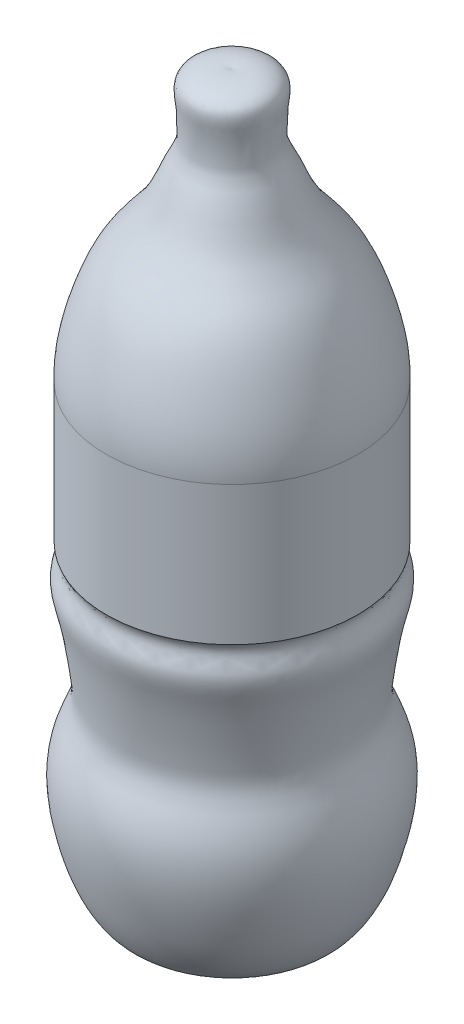
ISO-10303-21;
HEADER;
FILE_DESCRIPTION(('STEP AP214'),'2;1');
FILE_NAME('part.step','',(''),(''),'','','');
FILE_SCHEMA(('AUTOMOTIVE_DESIGN { 1 0 10303 214 1 1 1 1 }'));
ENDSEC;
DATA;
#1=APPLICATION_CONTEXT('core data for automotive mechanical design processes');
#2=APPLICATION_PROTOCOL_DEFINITION('international standard','automotive_design',2000,#1);
#3=PRODUCT_CONTEXT('',#1,'mechanical');
#4=PRODUCT('Part','Part','',(#3));
#5=PRODUCT_RELATED_PRODUCT_CATEGORY('part','',(#4));
#6=PRODUCT_DEFINITION_FORMATION('','',#4);
#7=PRODUCT_DEFINITION_CONTEXT('part definition',#1,'design');
#8=PRODUCT_DEFINITION('design','',#6,#7);
#9=PRODUCT_DEFINITION_SHAPE('','',#8);
#10=(LENGTH_UNIT() NAMED_UNIT(*) SI_UNIT(.MILLI.,.METRE.));
#11=(NAMED_UNIT(*) PLANE_ANGLE_UNIT() SI_UNIT($,.RADIAN.));
#12=(NAMED_UNIT(*) SI_UNIT($,.STERADIAN.) SOLID_ANGLE_UNIT());
#13=UNCERTAINTY_MEASURE_WITH_UNIT(LENGTH_MEASURE(1.E-05),#10,'distance_accuracy_value','');
#14=(GEOMETRIC_REPRESENTATION_CONTEXT(3) GLOBAL_UNCERTAINTY_ASSIGNED_CONTEXT((#13)) GLOBAL_UNIT_ASSIGNED_CONTEXT((#10,
#11,#12)) REPRESENTATION_CONTEXT('',''));
#15=CARTESIAN_POINT('',(0.,0.,0.));
#16=DIRECTION('',(0.,0.,1.));
#17=DIRECTION('',(1.,0.,0.));
#18=AXIS2_PLACEMENT_3D('',#15,#16,#17);
#19=CARTESIAN_POINT('',(249.750574620037,0.,0.));
#20=CARTESIAN_POINT('',(258.768179521763,-7.72913759661161,0.));
#21=CARTESIAN_POINT('',(260.413024150899,11.52132645601,0.));
#22=CARTESIAN_POINT('',(271.532024429474,5.49233822977273,0.));
#23=CARTESIAN_POINT('',(277.391679076081,4.16058757267027,0.));
#24=CARTESIAN_POINT('',(287.1289004241,3.42981019608447,0.));
#25=CARTESIAN_POINT('',(294.804967365125,13.9795699207011,0.));
#26=CARTESIAN_POINT('',(301.293605014085,32.2413946503106,0.));
#27=CARTESIAN_POINT('',(305.063456400707,52.7205472639311,0.));
#28=CARTESIAN_POINT('',(299.523184653869,69.0154930413008,0.));
#29=CARTESIAN_POINT('',(295.106882961106,78.1649184160245,0.));
#30=CARTESIAN_POINT('',(297.161339683282,93.15288009271,0.));
#31=CARTESIAN_POINT('',(299.07276851757,107.365279963085,0.));
#32=CARTESIAN_POINT('',(303.728431903094,122.671128770081,0.));
#33=CARTESIAN_POINT('',(298.456169404546,129.088087739287,0.));
#34=CARTESIAN_POINT('',(301.028778622845,132.761412626677,0.));
#35=B_SPLINE_CURVE_WITH_KNOTS('',3,(#19,#20,#21,#22,#23,#24,#25,#26,#27,#28,#29,#30,#31,#32,#33,
#34),.UNSPECIFIED.,.F.,.F.,(4,1,1,1,1,1,1,1,1,1,1,1,1,4),(0.,0.111971148087769,
0.132073979827729,0.195426633476266,0.221308076852359,0.292867474124238,0.38680518354073,
0.571065702470156,0.6253856587961,0.68268150715646,0.741550007736804,0.877711211222911,
0.939291410975679,1.),.UNSPECIFIED.);
#36=CARTESIAN_POINT('',(249.750574620037,4.04760416456607,0.));
#37=DIRECTION('',(0.,-1.,0.));
#38=AXIS1_PLACEMENT('',#36,#37);
#39=SURFACE_OF_REVOLUTION('',#35,#38);
#40=CARTESIAN_POINT('',(249.750574620037,132.761412626677,0.));
#41=DIRECTION('',(0.,-1.,0.));
#42=DIRECTION('',(0.,0.,-1.));
#43=AXIS2_PLACEMENT_3D('',#40,#41,#42);
#44=CIRCLE('',#43,51.2782040028079);
#45=CARTESIAN_POINT('',(249.750574620037,132.761412626677,-51.2782040028079));
#46=VERTEX_POINT('',#45);
#47=EDGE_CURVE('E54',#46,#46,#44,.T.);
#48=ORIENTED_EDGE('',*,*,#47,.T.);
#49=EDGE_LOOP('',(#48));
#50=FACE_BOUND('',#49,.T.);
#51=CARTESIAN_POINT('',(249.750574620037,0.,0.));
#52=VERTEX_POINT('',#51);
#53=VERTEX_LOOP('',#52);
#54=FACE_BOUND('',#53,.T.);
#55=ADVANCED_FACE('F45',(#50,#54),#39,.F.);
#56=CARTESIAN_POINT('',(301.028778622845,189.329901696012,0.));
#57=CARTESIAN_POINT('',(301.414869757066,198.520346087026,0.));
#58=CARTESIAN_POINT('',(297.733562202888,214.6986488146,0.));
#59=CARTESIAN_POINT('',(289.265915920008,235.885286327381,0.));
#60=CARTESIAN_POINT('',(275.304038076957,249.88585276053,0.));
#61=CARTESIAN_POINT('',(270.781218660766,264.239029998654,0.));
#62=CARTESIAN_POINT('',(265.017936322397,274.232918872448,0.));
#63=CARTESIAN_POINT('',(265.784738776242,279.920839544751,0.));
#64=CARTESIAN_POINT('',(265.776841786463,283.339110647926,0.));
#65=CARTESIAN_POINT('',(265.619684045642,287.899312184275,0.));
#66=CARTESIAN_POINT('',(269.453066609393,299.959518290072,0.));
#67=CARTESIAN_POINT('',(253.619368084675,300.909472286579,0.));
#68=CARTESIAN_POINT('',(249.750574620037,300.,0.));
#69=B_SPLINE_CURVE_WITH_KNOTS('',3,(#56,#57,#58,#59,#60,#61,#62,#63,#64,#65,#66,#67,#68),
.UNSPECIFIED.,.F.,.F.,(4,1,1,1,1,1,1,1,1,1,4),(0.,0.20838394899676,0.372389270764729,
0.512162522752278,0.645579083511608,0.712485927741127,0.765289156269757,0.771501300802537,
0.790137734400877,0.870895613327016,1.),.UNSPECIFIED.);
#70=CARTESIAN_POINT('',(249.750574620037,4.04760416456607,0.));
#71=DIRECTION('',(0.,-1.,0.));
#72=AXIS1_PLACEMENT('',#70,#71);
#73=SURFACE_OF_REVOLUTION('',#69,#72);
#74=CARTESIAN_POINT('',(249.750574620037,300.,0.));
#75=VERTEX_POINT('',#74);
#76=VERTEX_LOOP('',#75);
#77=FACE_BOUND('',#76,.T.);
#78=CARTESIAN_POINT('',(249.750574620037,189.329901696012,0.));
#79=DIRECTION('',(0.,-1.,0.));
#80=DIRECTION('',(0.,0.,-1.));
#81=AXIS2_PLACEMENT_3D('',#78,#79,#80);
#82=CIRCLE('',#81,51.2782040028079);
#83=CARTESIAN_POINT('',(249.750574620037,189.329901696012,-51.2782040028079));
#84=VERTEX_POINT('',#83);
#85=EDGE_CURVE('E11',#84,#84,#82,.T.);
#86=ORIENTED_EDGE('',*,*,#85,.F.);
#87=EDGE_LOOP('',(#86));
#88=FACE_BOUND('',#87,.T.);
#89=ADVANCED_FACE('F60',(#77,#88),#73,.F.);
#90=CARTESIAN_POINT('',(249.750574620037,4.04760416456607,0.));
#91=DIRECTION('',(0.,-1.,0.));
#92=DIRECTION('',(0.,0.,-1.));
#93=AXIS2_PLACEMENT_3D('',#90,#91,#92);
#94=CYLINDRICAL_SURFACE('',#93,51.2782040028079);
#95=ORIENTED_EDGE('',*,*,#85,.T.);
#96=EDGE_LOOP('',(#95));
#97=FACE_BOUND('',#96,.T.);
#98=ORIENTED_EDGE('',*,*,#47,.F.);
#99=EDGE_LOOP('',(#98));
#100=FACE_BOUND('',#99,.T.);
#101=ADVANCED_FACE('F63',(#97,#100),#94,.T.);
#102=CLOSED_SHELL('',(#55,#89,#101));
#103=MANIFOLD_SOLID_BREP('B2',#102);
#104=ADVANCED_BREP_SHAPE_REPRESENTATION('',(#18,#103),#14);
#105=SHAPE_DEFINITION_REPRESENTATION(#9,#104);
ENDSEC;
END-ISO-10303-21;
